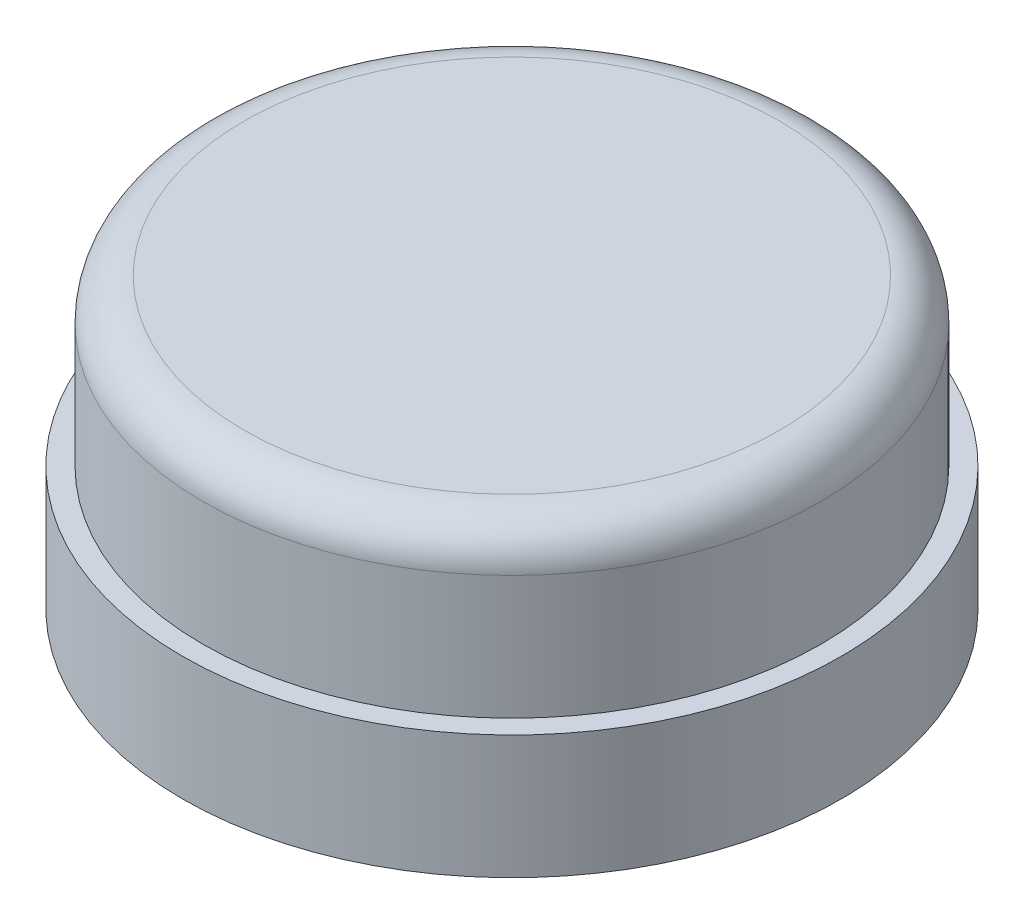
ISO-10303-21;
HEADER;
FILE_DESCRIPTION(('STEP AP214'),'2;1');
FILE_NAME('part.step','',(''),(''),'','','');
FILE_SCHEMA(('AUTOMOTIVE_DESIGN { 1 0 10303 214 1 1 1 1 }'));
ENDSEC;
DATA;
#1=APPLICATION_CONTEXT('core data for automotive mechanical design processes');
#2=APPLICATION_PROTOCOL_DEFINITION('international standard','automotive_design',2000,#1);
#3=PRODUCT_CONTEXT('',#1,'mechanical');
#4=PRODUCT('Part','Part','',(#3));
#5=PRODUCT_RELATED_PRODUCT_CATEGORY('part','',(#4));
#6=PRODUCT_DEFINITION_FORMATION('','',#4);
#7=PRODUCT_DEFINITION_CONTEXT('part definition',#1,'design');
#8=PRODUCT_DEFINITION('design','',#6,#7);
#9=PRODUCT_DEFINITION_SHAPE('','',#8);
#10=(LENGTH_UNIT() NAMED_UNIT(*) SI_UNIT(.MILLI.,.METRE.));
#11=(NAMED_UNIT(*) PLANE_ANGLE_UNIT() SI_UNIT($,.RADIAN.));
#12=(NAMED_UNIT(*) SI_UNIT($,.STERADIAN.) SOLID_ANGLE_UNIT());
#13=UNCERTAINTY_MEASURE_WITH_UNIT(LENGTH_MEASURE(1.E-05),#10,'distance_accuracy_value','');
#14=(GEOMETRIC_REPRESENTATION_CONTEXT(3) GLOBAL_UNCERTAINTY_ASSIGNED_CONTEXT((#13)) GLOBAL_UNIT_ASSIGNED_CONTEXT((#10,
#11,#12)) REPRESENTATION_CONTEXT('',''));
#15=CARTESIAN_POINT('',(0.,0.,0.));
#16=DIRECTION('',(0.,0.,1.));
#17=DIRECTION('',(1.,0.,0.));
#18=AXIS2_PLACEMENT_3D('',#15,#16,#17);
#19=CARTESIAN_POINT('',(0.,3.,0.));
#20=DIRECTION('',(0.,-1.,0.));
#21=DIRECTION('',(0.,0.,-1.));
#22=AXIS2_PLACEMENT_3D('',#19,#20,#21);
#23=CYLINDRICAL_SURFACE('',#22,8.);
#24=CARTESIAN_POINT('',(0.,3.,0.));
#25=DIRECTION('',(0.,1.,0.));
#26=DIRECTION('',(0.,0.,1.));
#27=AXIS2_PLACEMENT_3D('',#24,#25,#26);
#28=CIRCLE('',#27,8.);
#29=CARTESIAN_POINT('',(0.,3.,8.));
#30=VERTEX_POINT('',#29);
#31=EDGE_CURVE('E48',#30,#30,#28,.T.);
#32=ORIENTED_EDGE('',*,*,#31,.F.);
#33=EDGE_LOOP('',(#32));
#34=FACE_BOUND('',#33,.T.);
#35=CARTESIAN_POINT('',(0.,0.,0.));
#36=DIRECTION('',(0.,1.,0.));
#37=DIRECTION('',(0.,0.,1.));
#38=AXIS2_PLACEMENT_3D('',#35,#36,#37);
#39=CIRCLE('',#38,8.);
#40=CARTESIAN_POINT('',(0.,0.,8.));
#41=VERTEX_POINT('',#40);
#42=EDGE_CURVE('E51',#41,#41,#39,.T.);
#43=ORIENTED_EDGE('',*,*,#42,.T.);
#44=EDGE_LOOP('',(#43));
#45=FACE_BOUND('',#44,.T.);
#46=ADVANCED_FACE('F33',(#34,#45),#23,.T.);
#47=CARTESIAN_POINT('',(0.,3.,0.));
#48=DIRECTION('',(0.,1.,0.));
#49=DIRECTION('',(0.,0.,1.));
#50=AXIS2_PLACEMENT_3D('',#47,#48,#49);
#51=PLANE('',#50);
#52=CARTESIAN_POINT('',(0.,3.,0.));
#53=DIRECTION('',(0.,1.,0.));
#54=DIRECTION('',(0.,0.,1.));
#55=AXIS2_PLACEMENT_3D('',#52,#53,#54);
#56=CIRCLE('',#55,7.5);
#57=CARTESIAN_POINT('',(0.,3.,7.5));
#58=VERTEX_POINT('',#57);
#59=EDGE_CURVE('E44',#58,#58,#56,.T.);
#60=ORIENTED_EDGE('',*,*,#59,.F.);
#61=EDGE_LOOP('',(#60));
#62=FACE_BOUND('',#61,.T.);
#63=ORIENTED_EDGE('',*,*,#31,.T.);
#64=EDGE_LOOP('',(#63));
#65=FACE_BOUND('',#64,.T.);
#66=ADVANCED_FACE('F57',(#62,#65),#51,.T.);
#67=CARTESIAN_POINT('',(0.,0.,0.));
#68=DIRECTION('',(0.,1.,0.));
#69=DIRECTION('',(0.,0.,1.));
#70=AXIS2_PLACEMENT_3D('',#67,#68,#69);
#71=PLANE('',#70);
#72=ORIENTED_EDGE('',*,*,#42,.F.);
#73=EDGE_LOOP('',(#72));
#74=FACE_BOUND('',#73,.T.);
#75=ADVANCED_FACE('F63',(#74),#71,.F.);
#76=CARTESIAN_POINT('',(0.,7.,0.));
#77=DIRECTION('',(0.,-1.,0.));
#78=DIRECTION('',(0.,0.,-1.));
#79=AXIS2_PLACEMENT_3D('',#76,#77,#78);
#80=CYLINDRICAL_SURFACE('',#79,7.5);
#81=CARTESIAN_POINT('',(0.,6.,0.));
#82=DIRECTION('',(0.,1.,0.));
#83=DIRECTION('',(0.,0.,1.));
#84=AXIS2_PLACEMENT_3D('',#81,#82,#83);
#85=CIRCLE('',#84,7.5);
#86=CARTESIAN_POINT('',(0.,6.,7.5));
#87=VERTEX_POINT('',#86);
#88=EDGE_CURVE('E10',#87,#87,#85,.F.);
#89=ORIENTED_EDGE('',*,*,#88,.T.);
#90=EDGE_LOOP('',(#89));
#91=FACE_BOUND('',#90,.T.);
#92=ORIENTED_EDGE('',*,*,#59,.T.);
#93=EDGE_LOOP('',(#92));
#94=FACE_BOUND('',#93,.T.);
#95=ADVANCED_FACE('F65',(#91,#94),#80,.T.);
#96=CARTESIAN_POINT('',(0.,7.,0.));
#97=DIRECTION('',(0.,1.,0.));
#98=DIRECTION('',(0.,0.,1.));
#99=AXIS2_PLACEMENT_3D('',#96,#97,#98);
#100=PLANE('',#99);
#101=CARTESIAN_POINT('',(0.,7.,0.));
#102=DIRECTION('',(0.,1.,0.));
#103=DIRECTION('',(0.,0.,1.));
#104=AXIS2_PLACEMENT_3D('',#101,#102,#103);
#105=CIRCLE('',#104,6.5);
#106=CARTESIAN_POINT('',(0.,7.,6.5));
#107=VERTEX_POINT('',#106);
#108=EDGE_CURVE('E40',#107,#107,#105,.T.);
#109=ORIENTED_EDGE('',*,*,#108,.T.);
#110=EDGE_LOOP('',(#109));
#111=FACE_BOUND('',#110,.T.);
#112=ADVANCED_FACE('F71',(#111),#100,.T.);
#113=CARTESIAN_POINT('',(0.,6.,0.));
#114=DIRECTION('',(0.,1.,0.));
#115=DIRECTION('',(0.,0.,1.));
#116=AXIS2_PLACEMENT_3D('',#113,#114,#115);
#117=TOROIDAL_SURFACE('',#116,6.5,1.);
#118=ORIENTED_EDGE('',*,*,#88,.F.);
#119=EDGE_LOOP('',(#118));
#120=FACE_BOUND('',#119,.T.);
#121=ORIENTED_EDGE('',*,*,#108,.F.);
#122=EDGE_LOOP('',(#121));
#123=FACE_BOUND('',#122,.T.);
#124=ADVANCED_FACE('F35',(#120,#123),#117,.T.);
#125=CLOSED_SHELL('',(#46,#66,#75,#95,#112,#124));
#126=MANIFOLD_SOLID_BREP('B2',#125);
#127=ADVANCED_BREP_SHAPE_REPRESENTATION('',(#18,#126),#14);
#128=SHAPE_DEFINITION_REPRESENTATION(#9,#127);
ENDSEC;
END-ISO-10303-21;
